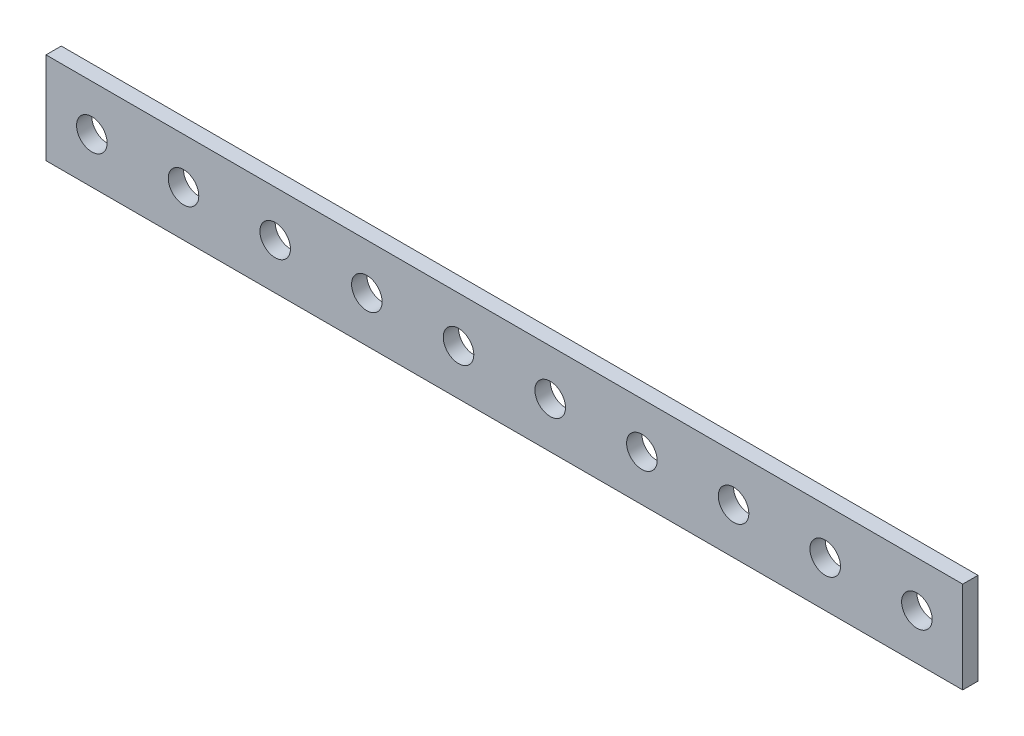
ISO-10303-21;
HEADER;
FILE_DESCRIPTION(('STEP AP214'),'2;1');
FILE_NAME('part.step','',(''),(''),'','','');
FILE_SCHEMA(('AUTOMOTIVE_DESIGN { 1 0 10303 214 1 1 1 1 }'));
ENDSEC;
DATA;
#1=APPLICATION_CONTEXT('core data for automotive mechanical design processes');
#2=APPLICATION_PROTOCOL_DEFINITION('international standard','automotive_design',2000,#1);
#3=PRODUCT_CONTEXT('',#1,'mechanical');
#4=PRODUCT('Part','Part','',(#3));
#5=PRODUCT_RELATED_PRODUCT_CATEGORY('part','',(#4));
#6=PRODUCT_DEFINITION_FORMATION('','',#4);
#7=PRODUCT_DEFINITION_CONTEXT('part definition',#1,'design');
#8=PRODUCT_DEFINITION('design','',#6,#7);
#9=PRODUCT_DEFINITION_SHAPE('','',#8);
#10=(LENGTH_UNIT() NAMED_UNIT(*) SI_UNIT(.MILLI.,.METRE.));
#11=(NAMED_UNIT(*) PLANE_ANGLE_UNIT() SI_UNIT($,.RADIAN.));
#12=(NAMED_UNIT(*) SI_UNIT($,.STERADIAN.) SOLID_ANGLE_UNIT());
#13=UNCERTAINTY_MEASURE_WITH_UNIT(LENGTH_MEASURE(1.E-05),#10,'distance_accuracy_value','');
#14=(GEOMETRIC_REPRESENTATION_CONTEXT(3) GLOBAL_UNCERTAINTY_ASSIGNED_CONTEXT((#13)) GLOBAL_UNIT_ASSIGNED_CONTEXT((#10,
#11,#12)) REPRESENTATION_CONTEXT('',''));
#15=CARTESIAN_POINT('',(0.,0.,0.));
#16=DIRECTION('',(0.,0.,1.));
#17=DIRECTION('',(1.,0.,0.));
#18=AXIS2_PLACEMENT_3D('',#15,#16,#17);
#19=CARTESIAN_POINT('',(0.,-1.5,-0.5));
#20=DIRECTION('',(0.,-1.,0.));
#21=DIRECTION('',(1.,0.,0.));
#22=AXIS2_PLACEMENT_3D('',#19,#20,#21);
#23=PLANE('',#22);
#24=DIRECTION('',(1.,0.,0.));
#25=VECTOR('',#24,1.);
#26=CARTESIAN_POINT('',(0.,-1.5,0.));
#27=LINE('',#26,#25);
#28=CARTESIAN_POINT('',(-1.5,-1.5,0.));
#29=VERTEX_POINT('',#28);
#30=CARTESIAN_POINT('',(28.5,-1.5,0.));
#31=VERTEX_POINT('',#30);
#32=EDGE_CURVE('E139',#29,#31,#27,.T.);
#33=ORIENTED_EDGE('',*,*,#32,.F.);
#34=DIRECTION('',(0.,0.,1.));
#35=VECTOR('',#34,1.);
#36=CARTESIAN_POINT('',(-1.5,-1.5,-0.5));
#37=LINE('',#36,#35);
#38=CARTESIAN_POINT('',(-1.5,-1.5,-0.5));
#39=VERTEX_POINT('',#38);
#40=EDGE_CURVE('E11',#39,#29,#37,.T.);
#41=ORIENTED_EDGE('',*,*,#40,.F.);
#42=DIRECTION('',(1.,0.,0.));
#43=VECTOR('',#42,1.);
#44=CARTESIAN_POINT('',(0.,-1.5,-0.5));
#45=LINE('',#44,#43);
#46=CARTESIAN_POINT('',(28.5,-1.5,-0.5));
#47=VERTEX_POINT('',#46);
#48=EDGE_CURVE('E97',#39,#47,#45,.T.);
#49=ORIENTED_EDGE('',*,*,#48,.T.);
#50=DIRECTION('',(0.,0.,1.));
#51=VECTOR('',#50,1.);
#52=CARTESIAN_POINT('',(28.5,-1.5,-0.5));
#53=LINE('',#52,#51);
#54=EDGE_CURVE('E40',#47,#31,#53,.T.);
#55=ORIENTED_EDGE('',*,*,#54,.T.);
#56=EDGE_LOOP('',(#33,#41,#49,#55));
#57=FACE_BOUND('',#56,.T.);
#58=ADVANCED_FACE('F36',(#57),#23,.T.);
#59=CARTESIAN_POINT('',(-1.5,0.,-0.5));
#60=DIRECTION('',(1.,0.,0.));
#61=DIRECTION('',(0.,1.,0.));
#62=AXIS2_PLACEMENT_3D('',#59,#60,#61);
#63=PLANE('',#62);
#64=DIRECTION('',(0.,1.,0.));
#65=VECTOR('',#64,1.);
#66=CARTESIAN_POINT('',(-1.5,0.,0.));
#67=LINE('',#66,#65);
#68=CARTESIAN_POINT('',(-1.5,1.5,0.));
#69=VERTEX_POINT('',#68);
#70=EDGE_CURVE('E145',#29,#69,#67,.T.);
#71=ORIENTED_EDGE('',*,*,#70,.T.);
#72=DIRECTION('',(0.,0.,1.));
#73=VECTOR('',#72,1.);
#74=CARTESIAN_POINT('',(-1.5,1.5,-0.5));
#75=LINE('',#74,#73);
#76=CARTESIAN_POINT('',(-1.5,1.5,-0.5));
#77=VERTEX_POINT('',#76);
#78=EDGE_CURVE('E46',#77,#69,#75,.T.);
#79=ORIENTED_EDGE('',*,*,#78,.F.);
#80=DIRECTION('',(0.,1.,0.));
#81=VECTOR('',#80,1.);
#82=CARTESIAN_POINT('',(-1.5,0.,-0.5));
#83=LINE('',#82,#81);
#84=EDGE_CURVE('E90',#39,#77,#83,.T.);
#85=ORIENTED_EDGE('',*,*,#84,.F.);
#86=ORIENTED_EDGE('',*,*,#40,.T.);
#87=EDGE_LOOP('',(#71,#79,#85,#86));
#88=FACE_BOUND('',#87,.T.);
#89=ADVANCED_FACE('F148',(#88),#63,.F.);
#90=CARTESIAN_POINT('',(0.,1.5,-0.5));
#91=DIRECTION('',(0.,-1.,0.));
#92=DIRECTION('',(0.,0.,-1.));
#93=AXIS2_PLACEMENT_3D('',#90,#91,#92);
#94=PLANE('',#93);
#95=DIRECTION('',(1.,0.,0.));
#96=VECTOR('',#95,1.);
#97=CARTESIAN_POINT('',(0.,1.5,0.));
#98=LINE('',#97,#96);
#99=CARTESIAN_POINT('',(28.5,1.5,0.));
#100=VERTEX_POINT('',#99);
#101=EDGE_CURVE('E71',#69,#100,#98,.T.);
#102=ORIENTED_EDGE('',*,*,#101,.T.);
#103=DIRECTION('',(0.,0.,1.));
#104=VECTOR('',#103,1.);
#105=CARTESIAN_POINT('',(28.5,1.5,-0.5));
#106=LINE('',#105,#104);
#107=CARTESIAN_POINT('',(28.5,1.5,-0.5));
#108=VERTEX_POINT('',#107);
#109=EDGE_CURVE('E94',#108,#100,#106,.T.);
#110=ORIENTED_EDGE('',*,*,#109,.F.);
#111=DIRECTION('',(1.,0.,0.));
#112=VECTOR('',#111,1.);
#113=CARTESIAN_POINT('',(0.,1.5,-0.5));
#114=LINE('',#113,#112);
#115=EDGE_CURVE('E85',#77,#108,#114,.T.);
#116=ORIENTED_EDGE('',*,*,#115,.F.);
#117=ORIENTED_EDGE('',*,*,#78,.T.);
#118=EDGE_LOOP('',(#102,#110,#116,#117));
#119=FACE_BOUND('',#118,.T.);
#120=ADVANCED_FACE('F95',(#119),#94,.F.);
#121=CARTESIAN_POINT('',(0.,0.,-0.5));
#122=DIRECTION('',(0.,0.,1.));
#123=DIRECTION('',(1.,0.,0.));
#124=AXIS2_PLACEMENT_3D('',#121,#122,#123);
#125=CYLINDRICAL_SURFACE('',#124,0.5);
#126=CARTESIAN_POINT('',(0.,0.,-0.5));
#127=DIRECTION('',(0.,0.,1.));
#128=DIRECTION('',(1.,0.,0.));
#129=AXIS2_PLACEMENT_3D('',#126,#127,#128);
#130=CIRCLE('',#129,0.5);
#131=CARTESIAN_POINT('',(0.5,0.,-0.5));
#132=VERTEX_POINT('',#131);
#133=EDGE_CURVE('E99',#132,#132,#130,.T.);
#134=ORIENTED_EDGE('',*,*,#133,.F.);
#135=EDGE_LOOP('',(#134));
#136=FACE_BOUND('',#135,.T.);
#137=CARTESIAN_POINT('',(0.,0.,0.));
#138=DIRECTION('',(0.,0.,1.));
#139=DIRECTION('',(1.,0.,0.));
#140=AXIS2_PLACEMENT_3D('',#137,#138,#139);
#141=CIRCLE('',#140,0.5);
#142=CARTESIAN_POINT('',(0.5,0.,0.));
#143=VERTEX_POINT('',#142);
#144=EDGE_CURVE('E135',#143,#143,#141,.T.);
#145=ORIENTED_EDGE('',*,*,#144,.T.);
#146=EDGE_LOOP('',(#145));
#147=FACE_BOUND('',#146,.T.);
#148=ADVANCED_FACE('F159',(#136,#147),#125,.F.);
#149=CARTESIAN_POINT('',(3.,0.,-0.5));
#150=DIRECTION('',(0.,0.,1.));
#151=DIRECTION('',(1.,0.,0.));
#152=AXIS2_PLACEMENT_3D('',#149,#150,#151);
#153=CYLINDRICAL_SURFACE('',#152,0.500000000000001);
#154=CARTESIAN_POINT('',(3.,0.,-0.5));
#155=DIRECTION('',(0.,0.,1.));
#156=DIRECTION('',(1.,0.,0.));
#157=AXIS2_PLACEMENT_3D('',#154,#155,#156);
#158=CIRCLE('',#157,0.500000000000001);
#159=CARTESIAN_POINT('',(3.5,0.,-0.5));
#160=VERTEX_POINT('',#159);
#161=EDGE_CURVE('E360',#160,#160,#158,.T.);
#162=ORIENTED_EDGE('',*,*,#161,.F.);
#163=EDGE_LOOP('',(#162));
#164=FACE_BOUND('',#163,.T.);
#165=CARTESIAN_POINT('',(3.,0.,0.));
#166=DIRECTION('',(0.,0.,1.));
#167=DIRECTION('',(1.,0.,0.));
#168=AXIS2_PLACEMENT_3D('',#165,#166,#167);
#169=CIRCLE('',#168,0.500000000000001);
#170=CARTESIAN_POINT('',(3.5,0.,0.));
#171=VERTEX_POINT('',#170);
#172=EDGE_CURVE('E131',#171,#171,#169,.T.);
#173=ORIENTED_EDGE('',*,*,#172,.T.);
#174=EDGE_LOOP('',(#173));
#175=FACE_BOUND('',#174,.T.);
#176=ADVANCED_FACE('F162',(#164,#175),#153,.F.);
#177=CARTESIAN_POINT('',(6.,0.,-0.5));
#178=DIRECTION('',(0.,0.,1.));
#179=DIRECTION('',(1.,0.,0.));
#180=AXIS2_PLACEMENT_3D('',#177,#178,#179);
#181=CYLINDRICAL_SURFACE('',#180,0.500000000000001);
#182=CARTESIAN_POINT('',(6.,0.,-0.5));
#183=DIRECTION('',(0.,0.,1.));
#184=DIRECTION('',(1.,0.,0.));
#185=AXIS2_PLACEMENT_3D('',#182,#183,#184);
#186=CIRCLE('',#185,0.500000000000001);
#187=CARTESIAN_POINT('',(6.5,0.,-0.5));
#188=VERTEX_POINT('',#187);
#189=EDGE_CURVE('E356',#188,#188,#186,.T.);
#190=ORIENTED_EDGE('',*,*,#189,.F.);
#191=EDGE_LOOP('',(#190));
#192=FACE_BOUND('',#191,.T.);
#193=CARTESIAN_POINT('',(6.,0.,0.));
#194=DIRECTION('',(0.,0.,1.));
#195=DIRECTION('',(1.,0.,0.));
#196=AXIS2_PLACEMENT_3D('',#193,#194,#195);
#197=CIRCLE('',#196,0.500000000000001);
#198=CARTESIAN_POINT('',(6.5,0.,0.));
#199=VERTEX_POINT('',#198);
#200=EDGE_CURVE('E127',#199,#199,#197,.T.);
#201=ORIENTED_EDGE('',*,*,#200,.T.);
#202=EDGE_LOOP('',(#201));
#203=FACE_BOUND('',#202,.T.);
#204=ADVANCED_FACE('F166',(#192,#203),#181,.F.);
#205=CARTESIAN_POINT('',(9.,0.,-0.5));
#206=DIRECTION('',(0.,0.,1.));
#207=DIRECTION('',(1.,0.,0.));
#208=AXIS2_PLACEMENT_3D('',#205,#206,#207);
#209=CYLINDRICAL_SURFACE('',#208,0.500000000000001);
#210=CARTESIAN_POINT('',(9.,0.,-0.5));
#211=DIRECTION('',(0.,0.,1.));
#212=DIRECTION('',(1.,0.,0.));
#213=AXIS2_PLACEMENT_3D('',#210,#211,#212);
#214=CIRCLE('',#213,0.500000000000001);
#215=CARTESIAN_POINT('',(9.5,0.,-0.5));
#216=VERTEX_POINT('',#215);
#217=EDGE_CURVE('E352',#216,#216,#214,.T.);
#218=ORIENTED_EDGE('',*,*,#217,.F.);
#219=EDGE_LOOP('',(#218));
#220=FACE_BOUND('',#219,.T.);
#221=CARTESIAN_POINT('',(9.,0.,0.));
#222=DIRECTION('',(0.,0.,1.));
#223=DIRECTION('',(1.,0.,0.));
#224=AXIS2_PLACEMENT_3D('',#221,#222,#223);
#225=CIRCLE('',#224,0.500000000000001);
#226=CARTESIAN_POINT('',(9.5,0.,0.));
#227=VERTEX_POINT('',#226);
#228=EDGE_CURVE('E123',#227,#227,#225,.T.);
#229=ORIENTED_EDGE('',*,*,#228,.T.);
#230=EDGE_LOOP('',(#229));
#231=FACE_BOUND('',#230,.T.);
#232=ADVANCED_FACE('F170',(#220,#231),#209,.F.);
#233=CARTESIAN_POINT('',(12.,0.,-0.5));
#234=DIRECTION('',(0.,0.,1.));
#235=DIRECTION('',(1.,0.,0.));
#236=AXIS2_PLACEMENT_3D('',#233,#234,#235);
#237=CYLINDRICAL_SURFACE('',#236,0.499999999999999);
#238=CARTESIAN_POINT('',(12.,0.,-0.5));
#239=DIRECTION('',(0.,0.,1.));
#240=DIRECTION('',(1.,0.,0.));
#241=AXIS2_PLACEMENT_3D('',#238,#239,#240);
#242=CIRCLE('',#241,0.499999999999999);
#243=CARTESIAN_POINT('',(12.5,0.,-0.5));
#244=VERTEX_POINT('',#243);
#245=EDGE_CURVE('E348',#244,#244,#242,.T.);
#246=ORIENTED_EDGE('',*,*,#245,.F.);
#247=EDGE_LOOP('',(#246));
#248=FACE_BOUND('',#247,.T.);
#249=CARTESIAN_POINT('',(12.,0.,0.));
#250=DIRECTION('',(0.,0.,1.));
#251=DIRECTION('',(1.,0.,0.));
#252=AXIS2_PLACEMENT_3D('',#249,#250,#251);
#253=CIRCLE('',#252,0.499999999999999);
#254=CARTESIAN_POINT('',(12.5,0.,0.));
#255=VERTEX_POINT('',#254);
#256=EDGE_CURVE('E119',#255,#255,#253,.T.);
#257=ORIENTED_EDGE('',*,*,#256,.T.);
#258=EDGE_LOOP('',(#257));
#259=FACE_BOUND('',#258,.T.);
#260=ADVANCED_FACE('F174',(#248,#259),#237,.F.);
#261=CARTESIAN_POINT('',(15.,0.,-0.5));
#262=DIRECTION('',(0.,0.,1.));
#263=DIRECTION('',(1.,0.,0.));
#264=AXIS2_PLACEMENT_3D('',#261,#262,#263);
#265=CYLINDRICAL_SURFACE('',#264,0.499999999999999);
#266=CARTESIAN_POINT('',(15.,0.,-0.5));
#267=DIRECTION('',(0.,0.,1.));
#268=DIRECTION('',(1.,0.,0.));
#269=AXIS2_PLACEMENT_3D('',#266,#267,#268);
#270=CIRCLE('',#269,0.499999999999999);
#271=CARTESIAN_POINT('',(15.5,0.,-0.5));
#272=VERTEX_POINT('',#271);
#273=EDGE_CURVE('E344',#272,#272,#270,.T.);
#274=ORIENTED_EDGE('',*,*,#273,.F.);
#275=EDGE_LOOP('',(#274));
#276=FACE_BOUND('',#275,.T.);
#277=CARTESIAN_POINT('',(15.,0.,0.));
#278=DIRECTION('',(0.,0.,1.));
#279=DIRECTION('',(1.,0.,0.));
#280=AXIS2_PLACEMENT_3D('',#277,#278,#279);
#281=CIRCLE('',#280,0.499999999999999);
#282=CARTESIAN_POINT('',(15.5,0.,0.));
#283=VERTEX_POINT('',#282);
#284=EDGE_CURVE('E116',#283,#283,#281,.T.);
#285=ORIENTED_EDGE('',*,*,#284,.T.);
#286=EDGE_LOOP('',(#285));
#287=FACE_BOUND('',#286,.T.);
#288=ADVANCED_FACE('F178',(#276,#287),#265,.F.);
#289=CARTESIAN_POINT('',(18.,0.,-0.5));
#290=DIRECTION('',(0.,0.,1.));
#291=DIRECTION('',(1.,0.,0.));
#292=AXIS2_PLACEMENT_3D('',#289,#290,#291);
#293=CYLINDRICAL_SURFACE('',#292,0.499999999999999);
#294=CARTESIAN_POINT('',(18.,0.,-0.5));
#295=DIRECTION('',(0.,0.,1.));
#296=DIRECTION('',(1.,0.,0.));
#297=AXIS2_PLACEMENT_3D('',#294,#295,#296);
#298=CIRCLE('',#297,0.499999999999999);
#299=CARTESIAN_POINT('',(18.5,0.,-0.5));
#300=VERTEX_POINT('',#299);
#301=EDGE_CURVE('E340',#300,#300,#298,.T.);
#302=ORIENTED_EDGE('',*,*,#301,.F.);
#303=EDGE_LOOP('',(#302));
#304=FACE_BOUND('',#303,.T.);
#305=CARTESIAN_POINT('',(18.,0.,0.));
#306=DIRECTION('',(0.,0.,1.));
#307=DIRECTION('',(1.,0.,0.));
#308=AXIS2_PLACEMENT_3D('',#305,#306,#307);
#309=CIRCLE('',#308,0.499999999999999);
#310=CARTESIAN_POINT('',(18.5,0.,0.));
#311=VERTEX_POINT('',#310);
#312=EDGE_CURVE('E113',#311,#311,#309,.T.);
#313=ORIENTED_EDGE('',*,*,#312,.T.);
#314=EDGE_LOOP('',(#313));
#315=FACE_BOUND('',#314,.T.);
#316=ADVANCED_FACE('F182',(#304,#315),#293,.F.);
#317=CARTESIAN_POINT('',(21.,0.,-0.5));
#318=DIRECTION('',(0.,0.,1.));
#319=DIRECTION('',(1.,0.,0.));
#320=AXIS2_PLACEMENT_3D('',#317,#318,#319);
#321=CYLINDRICAL_SURFACE('',#320,0.499999999999999);
#322=CARTESIAN_POINT('',(21.,0.,-0.5));
#323=DIRECTION('',(0.,0.,1.));
#324=DIRECTION('',(1.,0.,0.));
#325=AXIS2_PLACEMENT_3D('',#322,#323,#324);
#326=CIRCLE('',#325,0.499999999999999);
#327=CARTESIAN_POINT('',(21.5,0.,-0.5));
#328=VERTEX_POINT('',#327);
#329=EDGE_CURVE('E336',#328,#328,#326,.T.);
#330=ORIENTED_EDGE('',*,*,#329,.F.);
#331=EDGE_LOOP('',(#330));
#332=FACE_BOUND('',#331,.T.);
#333=CARTESIAN_POINT('',(21.,0.,0.));
#334=DIRECTION('',(0.,0.,1.));
#335=DIRECTION('',(1.,0.,0.));
#336=AXIS2_PLACEMENT_3D('',#333,#334,#335);
#337=CIRCLE('',#336,0.499999999999999);
#338=CARTESIAN_POINT('',(21.5,0.,0.));
#339=VERTEX_POINT('',#338);
#340=EDGE_CURVE('E110',#339,#339,#337,.T.);
#341=ORIENTED_EDGE('',*,*,#340,.T.);
#342=EDGE_LOOP('',(#341));
#343=FACE_BOUND('',#342,.T.);
#344=ADVANCED_FACE('F186',(#332,#343),#321,.F.);
#345=CARTESIAN_POINT('',(24.,0.,-0.5));
#346=DIRECTION('',(0.,0.,1.));
#347=DIRECTION('',(1.,0.,0.));
#348=AXIS2_PLACEMENT_3D('',#345,#346,#347);
#349=CYLINDRICAL_SURFACE('',#348,0.499999999999999);
#350=CARTESIAN_POINT('',(24.,0.,-0.5));
#351=DIRECTION('',(0.,0.,1.));
#352=DIRECTION('',(1.,0.,0.));
#353=AXIS2_PLACEMENT_3D('',#350,#351,#352);
#354=CIRCLE('',#353,0.499999999999999);
#355=CARTESIAN_POINT('',(24.5,0.,-0.5));
#356=VERTEX_POINT('',#355);
#357=EDGE_CURVE('E200',#356,#356,#354,.T.);
#358=ORIENTED_EDGE('',*,*,#357,.F.);
#359=EDGE_LOOP('',(#358));
#360=FACE_BOUND('',#359,.T.);
#361=CARTESIAN_POINT('',(24.,0.,0.));
#362=DIRECTION('',(0.,0.,1.));
#363=DIRECTION('',(1.,0.,0.));
#364=AXIS2_PLACEMENT_3D('',#361,#362,#363);
#365=CIRCLE('',#364,0.499999999999999);
#366=CARTESIAN_POINT('',(24.5,0.,0.));
#367=VERTEX_POINT('',#366);
#368=EDGE_CURVE('E107',#367,#367,#365,.T.);
#369=ORIENTED_EDGE('',*,*,#368,.T.);
#370=EDGE_LOOP('',(#369));
#371=FACE_BOUND('',#370,.T.);
#372=ADVANCED_FACE('F189',(#360,#371),#349,.F.);
#373=CARTESIAN_POINT('',(27.,0.,-0.5));
#374=DIRECTION('',(0.,0.,1.));
#375=DIRECTION('',(1.,0.,0.));
#376=AXIS2_PLACEMENT_3D('',#373,#374,#375);
#377=CYLINDRICAL_SURFACE('',#376,0.499999999999999);
#378=CARTESIAN_POINT('',(27.,0.,-0.5));
#379=DIRECTION('',(0.,0.,1.));
#380=DIRECTION('',(1.,0.,0.));
#381=AXIS2_PLACEMENT_3D('',#378,#379,#380);
#382=CIRCLE('',#381,0.499999999999999);
#383=CARTESIAN_POINT('',(27.5,0.,-0.5));
#384=VERTEX_POINT('',#383);
#385=EDGE_CURVE('E146',#384,#384,#382,.T.);
#386=ORIENTED_EDGE('',*,*,#385,.F.);
#387=EDGE_LOOP('',(#386));
#388=FACE_BOUND('',#387,.T.);
#389=CARTESIAN_POINT('',(27.,0.,0.));
#390=DIRECTION('',(0.,0.,1.));
#391=DIRECTION('',(1.,0.,0.));
#392=AXIS2_PLACEMENT_3D('',#389,#390,#391);
#393=CIRCLE('',#392,0.499999999999999);
#394=CARTESIAN_POINT('',(27.5,0.,0.));
#395=VERTEX_POINT('',#394);
#396=EDGE_CURVE('E104',#395,#395,#393,.T.);
#397=ORIENTED_EDGE('',*,*,#396,.T.);
#398=EDGE_LOOP('',(#397));
#399=FACE_BOUND('',#398,.T.);
#400=ADVANCED_FACE('F38',(#388,#399),#377,.F.);
#401=CARTESIAN_POINT('',(28.5,0.,-0.5));
#402=DIRECTION('',(1.,0.,0.));
#403=DIRECTION('',(0.,0.,-1.));
#404=AXIS2_PLACEMENT_3D('',#401,#402,#403);
#405=PLANE('',#404);
#406=DIRECTION('',(0.,1.,0.));
#407=VECTOR('',#406,1.);
#408=CARTESIAN_POINT('',(28.5,0.,0.));
#409=LINE('',#408,#407);
#410=EDGE_CURVE('E142',#31,#100,#409,.T.);
#411=ORIENTED_EDGE('',*,*,#410,.F.);
#412=ORIENTED_EDGE('',*,*,#54,.F.);
#413=DIRECTION('',(0.,1.,0.));
#414=VECTOR('',#413,1.);
#415=CARTESIAN_POINT('',(28.5,0.,-0.5));
#416=LINE('',#415,#414);
#417=EDGE_CURVE('E89',#47,#108,#416,.T.);
#418=ORIENTED_EDGE('',*,*,#417,.T.);
#419=ORIENTED_EDGE('',*,*,#109,.T.);
#420=EDGE_LOOP('',(#411,#412,#418,#419));
#421=FACE_BOUND('',#420,.T.);
#422=ADVANCED_FACE('F96',(#421),#405,.T.);
#423=CARTESIAN_POINT('',(0.,0.,-0.5));
#424=DIRECTION('',(0.,0.,1.));
#425=DIRECTION('',(1.,0.,0.));
#426=AXIS2_PLACEMENT_3D('',#423,#424,#425);
#427=PLANE('',#426);
#428=ORIENTED_EDGE('',*,*,#385,.T.);
#429=EDGE_LOOP('',(#428));
#430=FACE_BOUND('',#429,.T.);
#431=ORIENTED_EDGE('',*,*,#357,.T.);
#432=EDGE_LOOP('',(#431));
#433=FACE_BOUND('',#432,.T.);
#434=ORIENTED_EDGE('',*,*,#329,.T.);
#435=EDGE_LOOP('',(#434));
#436=FACE_BOUND('',#435,.T.);
#437=ORIENTED_EDGE('',*,*,#301,.T.);
#438=EDGE_LOOP('',(#437));
#439=FACE_BOUND('',#438,.T.);
#440=ORIENTED_EDGE('',*,*,#273,.T.);
#441=EDGE_LOOP('',(#440));
#442=FACE_BOUND('',#441,.T.);
#443=ORIENTED_EDGE('',*,*,#245,.T.);
#444=EDGE_LOOP('',(#443));
#445=FACE_BOUND('',#444,.T.);
#446=ORIENTED_EDGE('',*,*,#217,.T.);
#447=EDGE_LOOP('',(#446));
#448=FACE_BOUND('',#447,.T.);
#449=ORIENTED_EDGE('',*,*,#189,.T.);
#450=EDGE_LOOP('',(#449));
#451=FACE_BOUND('',#450,.T.);
#452=ORIENTED_EDGE('',*,*,#161,.T.);
#453=EDGE_LOOP('',(#452));
#454=FACE_BOUND('',#453,.T.);
#455=ORIENTED_EDGE('',*,*,#133,.T.);
#456=EDGE_LOOP('',(#455));
#457=FACE_BOUND('',#456,.T.);
#458=ORIENTED_EDGE('',*,*,#48,.F.);
#459=ORIENTED_EDGE('',*,*,#84,.T.);
#460=ORIENTED_EDGE('',*,*,#115,.T.);
#461=ORIENTED_EDGE('',*,*,#417,.F.);
#462=EDGE_LOOP('',(#458,#459,#460,#461));
#463=FACE_BOUND('',#462,.T.);
#464=ADVANCED_FACE('F88',(#430,#433,#436,#439,#442,#445,#448,#451,#454,#457,#463),#427,.F.);
#465=CARTESIAN_POINT('',(0.,0.,0.));
#466=DIRECTION('',(0.,0.,1.));
#467=DIRECTION('',(1.,0.,0.));
#468=AXIS2_PLACEMENT_3D('',#465,#466,#467);
#469=PLANE('',#468);
#470=ORIENTED_EDGE('',*,*,#396,.F.);
#471=EDGE_LOOP('',(#470));
#472=FACE_BOUND('',#471,.T.);
#473=ORIENTED_EDGE('',*,*,#368,.F.);
#474=EDGE_LOOP('',(#473));
#475=FACE_BOUND('',#474,.T.);
#476=ORIENTED_EDGE('',*,*,#340,.F.);
#477=EDGE_LOOP('',(#476));
#478=FACE_BOUND('',#477,.T.);
#479=ORIENTED_EDGE('',*,*,#312,.F.);
#480=EDGE_LOOP('',(#479));
#481=FACE_BOUND('',#480,.T.);
#482=ORIENTED_EDGE('',*,*,#284,.F.);
#483=EDGE_LOOP('',(#482));
#484=FACE_BOUND('',#483,.T.);
#485=ORIENTED_EDGE('',*,*,#256,.F.);
#486=EDGE_LOOP('',(#485));
#487=FACE_BOUND('',#486,.T.);
#488=ORIENTED_EDGE('',*,*,#228,.F.);
#489=EDGE_LOOP('',(#488));
#490=FACE_BOUND('',#489,.T.);
#491=ORIENTED_EDGE('',*,*,#200,.F.);
#492=EDGE_LOOP('',(#491));
#493=FACE_BOUND('',#492,.T.);
#494=ORIENTED_EDGE('',*,*,#172,.F.);
#495=EDGE_LOOP('',(#494));
#496=FACE_BOUND('',#495,.T.);
#497=ORIENTED_EDGE('',*,*,#144,.F.);
#498=EDGE_LOOP('',(#497));
#499=FACE_BOUND('',#498,.T.);
#500=ORIENTED_EDGE('',*,*,#32,.T.);
#501=ORIENTED_EDGE('',*,*,#410,.T.);
#502=ORIENTED_EDGE('',*,*,#101,.F.);
#503=ORIENTED_EDGE('',*,*,#70,.F.);
#504=EDGE_LOOP('',(#500,#501,#502,#503));
#505=FACE_BOUND('',#504,.T.);
#506=ADVANCED_FACE('F149',(#472,#475,#478,#481,#484,#487,#490,#493,#496,#499,#505),#469,.T.);
#507=CLOSED_SHELL('',(#58,#89,#120,#148,#176,#204,#232,#260,#288,#316,#344,#372,#400,#422,#464,#506));
#508=MANIFOLD_SOLID_BREP('B2',#507);
#509=ADVANCED_BREP_SHAPE_REPRESENTATION('',(#18,#508),#14);
#510=SHAPE_DEFINITION_REPRESENTATION(#9,#509);
ENDSEC;
END-ISO-10303-21;
